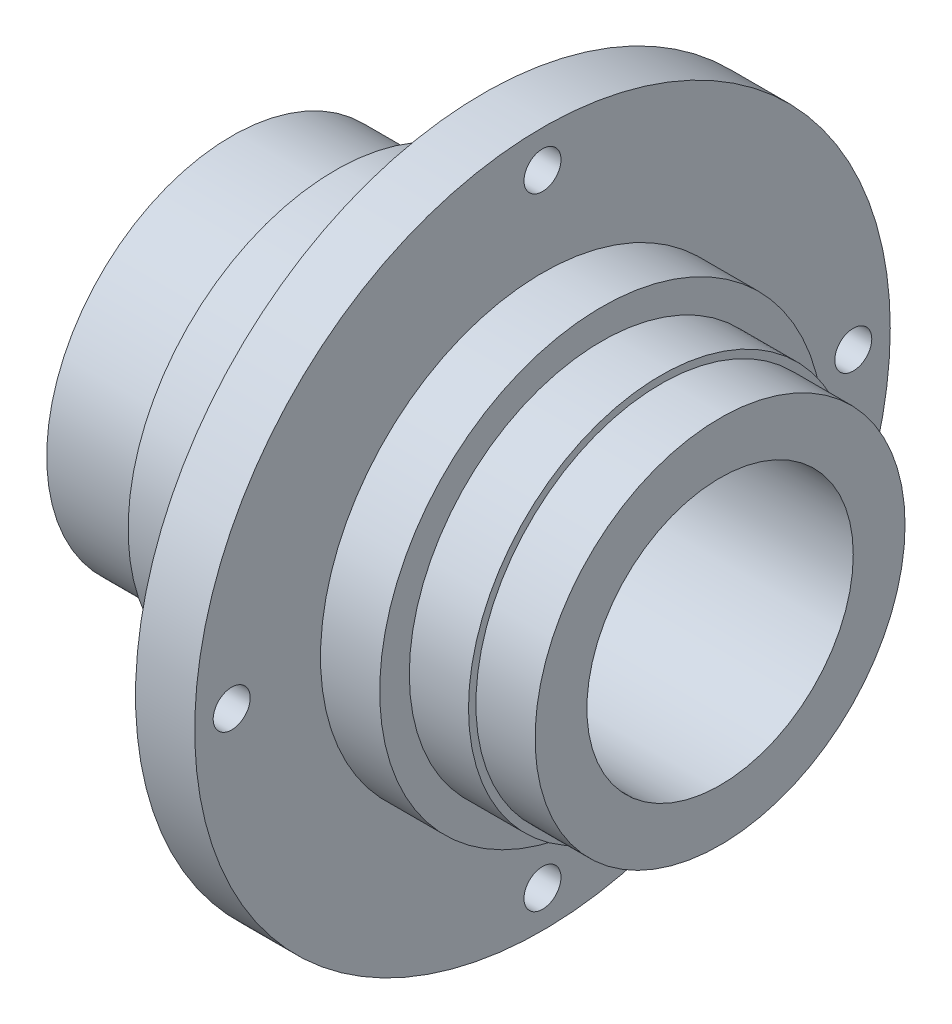
ISO-10303-21;
HEADER;
FILE_DESCRIPTION(('STEP AP214'),'2;1');
FILE_NAME('part.step','',(''),(''),'','','');
FILE_SCHEMA(('AUTOMOTIVE_DESIGN { 1 0 10303 214 1 1 1 1 }'));
ENDSEC;
DATA;
#1=APPLICATION_CONTEXT('core data for automotive mechanical design processes');
#2=APPLICATION_PROTOCOL_DEFINITION('international standard','automotive_design',2000,#1);
#3=PRODUCT_CONTEXT('',#1,'mechanical');
#4=PRODUCT('Part','Part','',(#3));
#5=PRODUCT_RELATED_PRODUCT_CATEGORY('part','',(#4));
#6=PRODUCT_DEFINITION_FORMATION('','',#4);
#7=PRODUCT_DEFINITION_CONTEXT('part definition',#1,'design');
#8=PRODUCT_DEFINITION('design','',#6,#7);
#9=PRODUCT_DEFINITION_SHAPE('','',#8);
#10=(LENGTH_UNIT() NAMED_UNIT(*) SI_UNIT(.MILLI.,.METRE.));
#11=(NAMED_UNIT(*) PLANE_ANGLE_UNIT() SI_UNIT($,.RADIAN.));
#12=(NAMED_UNIT(*) SI_UNIT($,.STERADIAN.) SOLID_ANGLE_UNIT());
#13=UNCERTAINTY_MEASURE_WITH_UNIT(LENGTH_MEASURE(1.E-05),#10,'distance_accuracy_value','');
#14=(GEOMETRIC_REPRESENTATION_CONTEXT(3) GLOBAL_UNCERTAINTY_ASSIGNED_CONTEXT((#13)) GLOBAL_UNIT_ASSIGNED_CONTEXT((#10,
#11,#12)) REPRESENTATION_CONTEXT('',''));
#15=CARTESIAN_POINT('',(0.,0.,0.));
#16=DIRECTION('',(0.,0.,1.));
#17=DIRECTION('',(1.,0.,0.));
#18=AXIS2_PLACEMENT_3D('',#15,#16,#17);
#19=CARTESIAN_POINT('',(7.,0.,0.));
#20=DIRECTION('',(-1.,0.,0.));
#21=DIRECTION('',(0.,0.,1.));
#22=AXIS2_PLACEMENT_3D('',#19,#20,#21);
#23=CYLINDRICAL_SURFACE('',#22,12.5);
#24=CARTESIAN_POINT('',(7.,0.,0.));
#25=DIRECTION('',(1.,0.,0.));
#26=DIRECTION('',(0.,0.,-1.));
#27=AXIS2_PLACEMENT_3D('',#24,#25,#26);
#28=CIRCLE('',#27,12.5);
#29=CARTESIAN_POINT('',(7.,0.,-12.5));
#30=VERTEX_POINT('',#29);
#31=EDGE_CURVE('E125',#30,#30,#28,.T.);
#32=ORIENTED_EDGE('',*,*,#31,.F.);
#33=EDGE_LOOP('',(#32));
#34=FACE_BOUND('',#33,.T.);
#35=CARTESIAN_POINT('',(0.,0.,0.));
#36=DIRECTION('',(1.,0.,0.));
#37=DIRECTION('',(0.,0.,-1.));
#38=AXIS2_PLACEMENT_3D('',#35,#36,#37);
#39=CIRCLE('',#38,12.5);
#40=CARTESIAN_POINT('',(0.,0.,-12.5));
#41=VERTEX_POINT('',#40);
#42=EDGE_CURVE('E122',#41,#41,#39,.T.);
#43=ORIENTED_EDGE('',*,*,#42,.T.);
#44=EDGE_LOOP('',(#43));
#45=FACE_BOUND('',#44,.T.);
#46=ADVANCED_FACE('F40',(#34,#45),#23,.T.);
#47=CARTESIAN_POINT('',(0.,0.,0.));
#48=DIRECTION('',(1.,0.,0.));
#49=DIRECTION('',(0.,0.,-1.));
#50=AXIS2_PLACEMENT_3D('',#47,#48,#49);
#51=PLANE('',#50);
#52=CARTESIAN_POINT('',(0.,0.,0.));
#53=DIRECTION('',(1.,0.,0.));
#54=DIRECTION('',(0.,0.,-1.));
#55=AXIS2_PLACEMENT_3D('',#52,#53,#54);
#56=CIRCLE('',#55,9.);
#57=CARTESIAN_POINT('',(0.,0.,-9.));
#58=VERTEX_POINT('',#57);
#59=EDGE_CURVE('E507',#58,#58,#56,.T.);
#60=ORIENTED_EDGE('',*,*,#59,.T.);
#61=EDGE_LOOP('',(#60));
#62=FACE_BOUND('',#61,.T.);
#63=CARTESIAN_POINT('',(0.,0.,-11.));
#64=DIRECTION('',(-1.,0.,0.));
#65=DIRECTION('',(0.,0.,1.));
#66=AXIS2_PLACEMENT_3D('',#63,#64,#65);
#67=CIRCLE('',#66,0.799999999999999);
#68=CARTESIAN_POINT('',(0.,0.,-10.2));
#69=VERTEX_POINT('',#68);
#70=EDGE_CURVE('E73',#69,#69,#67,.T.);
#71=ORIENTED_EDGE('',*,*,#70,.F.);
#72=EDGE_LOOP('',(#71));
#73=FACE_BOUND('',#72,.T.);
#74=CARTESIAN_POINT('',(0.,-11.,0.));
#75=DIRECTION('',(-1.,0.,0.));
#76=DIRECTION('',(0.,0.,1.));
#77=AXIS2_PLACEMENT_3D('',#74,#75,#76);
#78=CIRCLE('',#77,0.799999999999999);
#79=CARTESIAN_POINT('',(0.,-11.,0.8));
#80=VERTEX_POINT('',#79);
#81=EDGE_CURVE('E72',#80,#80,#78,.T.);
#82=ORIENTED_EDGE('',*,*,#81,.F.);
#83=EDGE_LOOP('',(#82));
#84=FACE_BOUND('',#83,.T.);
#85=CARTESIAN_POINT('',(0.,0.,11.));
#86=DIRECTION('',(-1.,0.,0.));
#87=DIRECTION('',(0.,0.,1.));
#88=AXIS2_PLACEMENT_3D('',#85,#86,#87);
#89=CIRCLE('',#88,0.799999999999999);
#90=CARTESIAN_POINT('',(0.,0.,11.8));
#91=VERTEX_POINT('',#90);
#92=EDGE_CURVE('E85',#91,#91,#89,.T.);
#93=ORIENTED_EDGE('',*,*,#92,.F.);
#94=EDGE_LOOP('',(#93));
#95=FACE_BOUND('',#94,.T.);
#96=CARTESIAN_POINT('',(0.,11.,0.));
#97=DIRECTION('',(-1.,0.,0.));
#98=DIRECTION('',(0.,0.,1.));
#99=AXIS2_PLACEMENT_3D('',#96,#97,#98);
#100=CIRCLE('',#99,0.799999999999999);
#101=CARTESIAN_POINT('',(0.,11.,0.799999999999999));
#102=VERTEX_POINT('',#101);
#103=EDGE_CURVE('E91',#102,#102,#100,.T.);
#104=ORIENTED_EDGE('',*,*,#103,.F.);
#105=EDGE_LOOP('',(#104));
#106=FACE_BOUND('',#105,.T.);
#107=ORIENTED_EDGE('',*,*,#42,.F.);
#108=EDGE_LOOP('',(#107));
#109=FACE_BOUND('',#108,.T.);
#110=ADVANCED_FACE('F156',(#62,#73,#84,#95,#106,#109),#51,.F.);
#111=CARTESIAN_POINT('',(17.,0.,0.));
#112=DIRECTION('',(-1.,0.,0.));
#113=DIRECTION('',(0.,0.,1.));
#114=AXIS2_PLACEMENT_3D('',#111,#112,#113);
#115=CYLINDRICAL_SURFACE('',#114,14.);
#116=CARTESIAN_POINT('',(17.,0.,0.));
#117=DIRECTION('',(1.,0.,0.));
#118=DIRECTION('',(0.,0.,-1.));
#119=AXIS2_PLACEMENT_3D('',#116,#117,#118);
#120=CIRCLE('',#119,14.);
#121=CARTESIAN_POINT('',(17.,0.,-14.));
#122=VERTEX_POINT('',#121);
#123=EDGE_CURVE('E119',#122,#122,#120,.T.);
#124=ORIENTED_EDGE('',*,*,#123,.F.);
#125=EDGE_LOOP('',(#124));
#126=FACE_BOUND('',#125,.T.);
#127=CARTESIAN_POINT('',(7.,0.,0.));
#128=DIRECTION('',(1.,0.,0.));
#129=DIRECTION('',(0.,0.,-1.));
#130=AXIS2_PLACEMENT_3D('',#127,#128,#129);
#131=CIRCLE('',#130,14.);
#132=CARTESIAN_POINT('',(7.,0.,-14.));
#133=VERTEX_POINT('',#132);
#134=EDGE_CURVE('E115',#133,#133,#131,.T.);
#135=ORIENTED_EDGE('',*,*,#134,.T.);
#136=EDGE_LOOP('',(#135));
#137=FACE_BOUND('',#136,.T.);
#138=ADVANCED_FACE('F161',(#126,#137),#115,.T.);
#139=CARTESIAN_POINT('',(7.,0.,0.));
#140=DIRECTION('',(1.,0.,0.));
#141=DIRECTION('',(0.,0.,-1.));
#142=AXIS2_PLACEMENT_3D('',#139,#140,#141);
#143=PLANE('',#142);
#144=ORIENTED_EDGE('',*,*,#31,.T.);
#145=EDGE_LOOP('',(#144));
#146=FACE_BOUND('',#145,.T.);
#147=ORIENTED_EDGE('',*,*,#134,.F.);
#148=EDGE_LOOP('',(#147));
#149=FACE_BOUND('',#148,.T.);
#150=ADVANCED_FACE('F168',(#146,#149),#143,.F.);
#151=CARTESIAN_POINT('',(21.,0.,0.));
#152=DIRECTION('',(-1.,0.,0.));
#153=DIRECTION('',(0.,0.,1.));
#154=AXIS2_PLACEMENT_3D('',#151,#152,#153);
#155=CYLINDRICAL_SURFACE('',#154,23.5);
#156=CARTESIAN_POINT('',(21.,0.,0.));
#157=DIRECTION('',(1.,0.,0.));
#158=DIRECTION('',(0.,0.,-1.));
#159=AXIS2_PLACEMENT_3D('',#156,#157,#158);
#160=CIRCLE('',#159,23.5);
#161=CARTESIAN_POINT('',(21.,0.,-23.5));
#162=VERTEX_POINT('',#161);
#163=EDGE_CURVE('E112',#162,#162,#160,.T.);
#164=ORIENTED_EDGE('',*,*,#163,.F.);
#165=EDGE_LOOP('',(#164));
#166=FACE_BOUND('',#165,.T.);
#167=CARTESIAN_POINT('',(17.,0.,0.));
#168=DIRECTION('',(1.,0.,0.));
#169=DIRECTION('',(0.,0.,-1.));
#170=AXIS2_PLACEMENT_3D('',#167,#168,#169);
#171=CIRCLE('',#170,23.5);
#172=CARTESIAN_POINT('',(17.,0.,-23.5));
#173=VERTEX_POINT('',#172);
#174=EDGE_CURVE('E116',#173,#173,#171,.T.);
#175=ORIENTED_EDGE('',*,*,#174,.T.);
#176=EDGE_LOOP('',(#175));
#177=FACE_BOUND('',#176,.T.);
#178=ADVANCED_FACE('F171',(#166,#177),#155,.T.);
#179=CARTESIAN_POINT('',(21.,0.,0.));
#180=DIRECTION('',(1.,0.,0.));
#181=DIRECTION('',(0.,0.,-1.));
#182=AXIS2_PLACEMENT_3D('',#179,#180,#181);
#183=PLANE('',#182);
#184=CARTESIAN_POINT('',(21.,0.,0.));
#185=DIRECTION('',(1.,0.,0.));
#186=DIRECTION('',(0.,0.,-1.));
#187=AXIS2_PLACEMENT_3D('',#184,#185,#186);
#188=CIRCLE('',#187,15.);
#189=CARTESIAN_POINT('',(21.,0.,-15.));
#190=VERTEX_POINT('',#189);
#191=EDGE_CURVE('E517',#190,#190,#188,.T.);
#192=ORIENTED_EDGE('',*,*,#191,.F.);
#193=EDGE_LOOP('',(#192));
#194=FACE_BOUND('',#193,.T.);
#195=CARTESIAN_POINT('',(21.,21.,0.));
#196=DIRECTION('',(1.,0.,0.));
#197=DIRECTION('',(0.,0.,-1.));
#198=AXIS2_PLACEMENT_3D('',#195,#196,#197);
#199=CIRCLE('',#198,1.25);
#200=CARTESIAN_POINT('',(21.,21.,-1.25));
#201=VERTEX_POINT('',#200);
#202=EDGE_CURVE('E97',#201,#201,#199,.T.);
#203=ORIENTED_EDGE('',*,*,#202,.F.);
#204=EDGE_LOOP('',(#203));
#205=FACE_BOUND('',#204,.T.);
#206=CARTESIAN_POINT('',(21.,0.,-21.));
#207=DIRECTION('',(1.,0.,0.));
#208=DIRECTION('',(0.,0.,-1.));
#209=AXIS2_PLACEMENT_3D('',#206,#207,#208);
#210=CIRCLE('',#209,1.25);
#211=CARTESIAN_POINT('',(21.,0.,-22.25));
#212=VERTEX_POINT('',#211);
#213=EDGE_CURVE('E100',#212,#212,#210,.T.);
#214=ORIENTED_EDGE('',*,*,#213,.F.);
#215=EDGE_LOOP('',(#214));
#216=FACE_BOUND('',#215,.T.);
#217=CARTESIAN_POINT('',(21.,-21.,0.));
#218=DIRECTION('',(1.,0.,0.));
#219=DIRECTION('',(0.,0.,-1.));
#220=AXIS2_PLACEMENT_3D('',#217,#218,#219);
#221=CIRCLE('',#220,1.25);
#222=CARTESIAN_POINT('',(21.,-21.,-1.25));
#223=VERTEX_POINT('',#222);
#224=EDGE_CURVE('E104',#223,#223,#221,.T.);
#225=ORIENTED_EDGE('',*,*,#224,.F.);
#226=EDGE_LOOP('',(#225));
#227=FACE_BOUND('',#226,.T.);
#228=CARTESIAN_POINT('',(21.,0.,21.));
#229=DIRECTION('',(1.,0.,0.));
#230=DIRECTION('',(0.,0.,-1.));
#231=AXIS2_PLACEMENT_3D('',#228,#229,#230);
#232=CIRCLE('',#231,1.25);
#233=CARTESIAN_POINT('',(21.,0.,19.75));
#234=VERTEX_POINT('',#233);
#235=EDGE_CURVE('E108',#234,#234,#232,.T.);
#236=ORIENTED_EDGE('',*,*,#235,.F.);
#237=EDGE_LOOP('',(#236));
#238=FACE_BOUND('',#237,.T.);
#239=ORIENTED_EDGE('',*,*,#163,.T.);
#240=EDGE_LOOP('',(#239));
#241=FACE_BOUND('',#240,.T.);
#242=ADVANCED_FACE('F184',(#194,#205,#216,#227,#238,#241),#183,.T.);
#243=CARTESIAN_POINT('',(17.,0.,0.));
#244=DIRECTION('',(1.,0.,0.));
#245=DIRECTION('',(0.,0.,-1.));
#246=AXIS2_PLACEMENT_3D('',#243,#244,#245);
#247=PLANE('',#246);
#248=CARTESIAN_POINT('',(17.,21.,0.));
#249=DIRECTION('',(1.,0.,0.));
#250=DIRECTION('',(0.,0.,-1.));
#251=AXIS2_PLACEMENT_3D('',#248,#249,#250);
#252=CIRCLE('',#251,1.25);
#253=CARTESIAN_POINT('',(17.,21.,-1.25));
#254=VERTEX_POINT('',#253);
#255=EDGE_CURVE('E43',#254,#254,#252,.T.);
#256=ORIENTED_EDGE('',*,*,#255,.T.);
#257=EDGE_LOOP('',(#256));
#258=FACE_BOUND('',#257,.T.);
#259=CARTESIAN_POINT('',(17.,0.,-21.));
#260=DIRECTION('',(1.,0.,0.));
#261=DIRECTION('',(0.,0.,-1.));
#262=AXIS2_PLACEMENT_3D('',#259,#260,#261);
#263=CIRCLE('',#262,1.25);
#264=CARTESIAN_POINT('',(17.,0.,-22.25));
#265=VERTEX_POINT('',#264);
#266=EDGE_CURVE('E103',#265,#265,#263,.T.);
#267=ORIENTED_EDGE('',*,*,#266,.T.);
#268=EDGE_LOOP('',(#267));
#269=FACE_BOUND('',#268,.T.);
#270=CARTESIAN_POINT('',(17.,-21.,0.));
#271=DIRECTION('',(1.,0.,0.));
#272=DIRECTION('',(0.,0.,-1.));
#273=AXIS2_PLACEMENT_3D('',#270,#271,#272);
#274=CIRCLE('',#273,1.25);
#275=CARTESIAN_POINT('',(17.,-21.,-1.25));
#276=VERTEX_POINT('',#275);
#277=EDGE_CURVE('E107',#276,#276,#274,.T.);
#278=ORIENTED_EDGE('',*,*,#277,.T.);
#279=EDGE_LOOP('',(#278));
#280=FACE_BOUND('',#279,.T.);
#281=CARTESIAN_POINT('',(17.,0.,21.));
#282=DIRECTION('',(1.,0.,0.));
#283=DIRECTION('',(0.,0.,-1.));
#284=AXIS2_PLACEMENT_3D('',#281,#282,#283);
#285=CIRCLE('',#284,1.25);
#286=CARTESIAN_POINT('',(17.,0.,19.75));
#287=VERTEX_POINT('',#286);
#288=EDGE_CURVE('E111',#287,#287,#285,.T.);
#289=ORIENTED_EDGE('',*,*,#288,.T.);
#290=EDGE_LOOP('',(#289));
#291=FACE_BOUND('',#290,.T.);
#292=ORIENTED_EDGE('',*,*,#123,.T.);
#293=EDGE_LOOP('',(#292));
#294=FACE_BOUND('',#293,.T.);
#295=ORIENTED_EDGE('',*,*,#174,.F.);
#296=EDGE_LOOP('',(#295));
#297=FACE_BOUND('',#296,.T.);
#298=ADVANCED_FACE('F136',(#258,#269,#280,#291,#294,#297),#247,.F.);
#299=CARTESIAN_POINT('',(21.,0.,21.));
#300=DIRECTION('',(1.,0.,0.));
#301=DIRECTION('',(0.,0.,-1.));
#302=AXIS2_PLACEMENT_3D('',#299,#300,#301);
#303=CYLINDRICAL_SURFACE('',#302,1.25);
#304=ORIENTED_EDGE('',*,*,#235,.T.);
#305=EDGE_LOOP('',(#304));
#306=FACE_BOUND('',#305,.T.);
#307=ORIENTED_EDGE('',*,*,#288,.F.);
#308=EDGE_LOOP('',(#307));
#309=FACE_BOUND('',#308,.T.);
#310=ADVANCED_FACE('F152',(#306,#309),#303,.F.);
#311=CARTESIAN_POINT('',(21.,-21.,0.));
#312=DIRECTION('',(1.,0.,0.));
#313=DIRECTION('',(0.,0.,-1.));
#314=AXIS2_PLACEMENT_3D('',#311,#312,#313);
#315=CYLINDRICAL_SURFACE('',#314,1.25);
#316=ORIENTED_EDGE('',*,*,#224,.T.);
#317=EDGE_LOOP('',(#316));
#318=FACE_BOUND('',#317,.T.);
#319=ORIENTED_EDGE('',*,*,#277,.F.);
#320=EDGE_LOOP('',(#319));
#321=FACE_BOUND('',#320,.T.);
#322=ADVANCED_FACE('F142',(#318,#321),#315,.F.);
#323=CARTESIAN_POINT('',(21.,0.,-21.));
#324=DIRECTION('',(1.,0.,0.));
#325=DIRECTION('',(0.,0.,-1.));
#326=AXIS2_PLACEMENT_3D('',#323,#324,#325);
#327=CYLINDRICAL_SURFACE('',#326,1.25);
#328=ORIENTED_EDGE('',*,*,#213,.T.);
#329=EDGE_LOOP('',(#328));
#330=FACE_BOUND('',#329,.T.);
#331=ORIENTED_EDGE('',*,*,#266,.F.);
#332=EDGE_LOOP('',(#331));
#333=FACE_BOUND('',#332,.T.);
#334=ADVANCED_FACE('F139',(#330,#333),#327,.F.);
#335=CARTESIAN_POINT('',(21.,21.,0.));
#336=DIRECTION('',(1.,0.,0.));
#337=DIRECTION('',(0.,0.,-1.));
#338=AXIS2_PLACEMENT_3D('',#335,#336,#337);
#339=CYLINDRICAL_SURFACE('',#338,1.25);
#340=ORIENTED_EDGE('',*,*,#202,.T.);
#341=EDGE_LOOP('',(#340));
#342=FACE_BOUND('',#341,.T.);
#343=ORIENTED_EDGE('',*,*,#255,.F.);
#344=EDGE_LOOP('',(#343));
#345=FACE_BOUND('',#344,.T.);
#346=ADVANCED_FACE('F141',(#342,#345),#339,.F.);
#347=CARTESIAN_POINT('',(6.,11.,0.));
#348=DIRECTION('',(-1.,0.,0.));
#349=DIRECTION('',(0.,0.,1.));
#350=AXIS2_PLACEMENT_3D('',#347,#348,#349);
#351=CONICAL_SURFACE('',#350,0.799999999999997,1.02974425867665);
#352=CARTESIAN_POINT('',(6.48068849522205,11.,0.));
#353=VERTEX_POINT('',#352);
#354=VERTEX_LOOP('',#353);
#355=FACE_BOUND('',#354,.T.);
#356=CARTESIAN_POINT('',(6.,11.,0.));
#357=DIRECTION('',(-1.,0.,0.));
#358=DIRECTION('',(0.,0.,1.));
#359=AXIS2_PLACEMENT_3D('',#356,#357,#358);
#360=CIRCLE('',#359,0.799999999999997);
#361=CARTESIAN_POINT('',(6.,11.,0.799999999999997));
#362=VERTEX_POINT('',#361);
#363=EDGE_CURVE('E94',#362,#362,#360,.T.);
#364=ORIENTED_EDGE('',*,*,#363,.T.);
#365=EDGE_LOOP('',(#364));
#366=FACE_BOUND('',#365,.T.);
#367=ADVANCED_FACE('F149',(#355,#366),#351,.F.);
#368=CARTESIAN_POINT('',(0.,11.,0.));
#369=DIRECTION('',(-1.,0.,0.));
#370=DIRECTION('',(0.,0.,1.));
#371=AXIS2_PLACEMENT_3D('',#368,#369,#370);
#372=CYLINDRICAL_SURFACE('',#371,0.799999999999998);
#373=ORIENTED_EDGE('',*,*,#363,.F.);
#374=EDGE_LOOP('',(#373));
#375=FACE_BOUND('',#374,.T.);
#376=ORIENTED_EDGE('',*,*,#103,.T.);
#377=EDGE_LOOP('',(#376));
#378=FACE_BOUND('',#377,.T.);
#379=ADVANCED_FACE('F236',(#375,#378),#372,.F.);
#380=CARTESIAN_POINT('',(6.,0.,11.));
#381=DIRECTION('',(-1.,0.,0.));
#382=DIRECTION('',(0.,0.,1.));
#383=AXIS2_PLACEMENT_3D('',#380,#381,#382);
#384=CONICAL_SURFACE('',#383,0.799999999999997,1.02974425867665);
#385=CARTESIAN_POINT('',(6.48068849522205,0.,11.));
#386=VERTEX_POINT('',#385);
#387=VERTEX_LOOP('',#386);
#388=FACE_BOUND('',#387,.T.);
#389=CARTESIAN_POINT('',(6.,0.,11.));
#390=DIRECTION('',(-1.,0.,0.));
#391=DIRECTION('',(0.,0.,1.));
#392=AXIS2_PLACEMENT_3D('',#389,#390,#391);
#393=CIRCLE('',#392,0.799999999999997);
#394=CARTESIAN_POINT('',(6.,0.,11.8));
#395=VERTEX_POINT('',#394);
#396=EDGE_CURVE('E88',#395,#395,#393,.T.);
#397=ORIENTED_EDGE('',*,*,#396,.T.);
#398=EDGE_LOOP('',(#397));
#399=FACE_BOUND('',#398,.T.);
#400=ADVANCED_FACE('F242',(#388,#399),#384,.F.);
#401=CARTESIAN_POINT('',(0.,0.,11.));
#402=DIRECTION('',(-1.,0.,0.));
#403=DIRECTION('',(0.,0.,1.));
#404=AXIS2_PLACEMENT_3D('',#401,#402,#403);
#405=CYLINDRICAL_SURFACE('',#404,0.799999999999998);
#406=ORIENTED_EDGE('',*,*,#396,.F.);
#407=EDGE_LOOP('',(#406));
#408=FACE_BOUND('',#407,.T.);
#409=ORIENTED_EDGE('',*,*,#92,.T.);
#410=EDGE_LOOP('',(#409));
#411=FACE_BOUND('',#410,.T.);
#412=ADVANCED_FACE('F264',(#408,#411),#405,.F.);
#413=CARTESIAN_POINT('',(6.,-11.,0.));
#414=DIRECTION('',(-1.,0.,0.));
#415=DIRECTION('',(0.,0.,1.));
#416=AXIS2_PLACEMENT_3D('',#413,#414,#415);
#417=CONICAL_SURFACE('',#416,0.799999999999997,1.02974425867665);
#418=CARTESIAN_POINT('',(6.48068849522205,-11.,0.));
#419=VERTEX_POINT('',#418);
#420=VERTEX_LOOP('',#419);
#421=FACE_BOUND('',#420,.T.);
#422=CARTESIAN_POINT('',(6.,-11.,0.));
#423=DIRECTION('',(-1.,0.,0.));
#424=DIRECTION('',(0.,0.,1.));
#425=AXIS2_PLACEMENT_3D('',#422,#423,#424);
#426=CIRCLE('',#425,0.799999999999997);
#427=CARTESIAN_POINT('',(6.,-11.,0.799999999999998));
#428=VERTEX_POINT('',#427);
#429=EDGE_CURVE('E76',#428,#428,#426,.T.);
#430=ORIENTED_EDGE('',*,*,#429,.T.);
#431=EDGE_LOOP('',(#430));
#432=FACE_BOUND('',#431,.T.);
#433=ADVANCED_FACE('F267',(#421,#432),#417,.F.);
#434=CARTESIAN_POINT('',(0.,-11.,0.));
#435=DIRECTION('',(-1.,0.,0.));
#436=DIRECTION('',(0.,0.,1.));
#437=AXIS2_PLACEMENT_3D('',#434,#435,#436);
#438=CYLINDRICAL_SURFACE('',#437,0.799999999999998);
#439=ORIENTED_EDGE('',*,*,#429,.F.);
#440=EDGE_LOOP('',(#439));
#441=FACE_BOUND('',#440,.T.);
#442=ORIENTED_EDGE('',*,*,#81,.T.);
#443=EDGE_LOOP('',(#442));
#444=FACE_BOUND('',#443,.T.);
#445=ADVANCED_FACE('F66',(#441,#444),#438,.F.);
#446=CARTESIAN_POINT('',(6.,0.,-11.));
#447=DIRECTION('',(-1.,0.,0.));
#448=DIRECTION('',(0.,0.,1.));
#449=AXIS2_PLACEMENT_3D('',#446,#447,#448);
#450=CONICAL_SURFACE('',#449,0.799999999999997,1.02974425867665);
#451=CARTESIAN_POINT('',(6.48068849522205,0.,-11.));
#452=VERTEX_POINT('',#451);
#453=VERTEX_LOOP('',#452);
#454=FACE_BOUND('',#453,.T.);
#455=CARTESIAN_POINT('',(6.,0.,-11.));
#456=DIRECTION('',(-1.,0.,0.));
#457=DIRECTION('',(0.,0.,1.));
#458=AXIS2_PLACEMENT_3D('',#455,#456,#457);
#459=CIRCLE('',#458,0.799999999999997);
#460=CARTESIAN_POINT('',(6.,0.,-10.2));
#461=VERTEX_POINT('',#460);
#462=EDGE_CURVE('E70',#461,#461,#459,.T.);
#463=ORIENTED_EDGE('',*,*,#462,.T.);
#464=EDGE_LOOP('',(#463));
#465=FACE_BOUND('',#464,.T.);
#466=ADVANCED_FACE('F62',(#454,#465),#450,.F.);
#467=CARTESIAN_POINT('',(0.,0.,-11.));
#468=DIRECTION('',(-1.,0.,0.));
#469=DIRECTION('',(0.,0.,1.));
#470=AXIS2_PLACEMENT_3D('',#467,#468,#469);
#471=CYLINDRICAL_SURFACE('',#470,0.799999999999998);
#472=ORIENTED_EDGE('',*,*,#462,.F.);
#473=EDGE_LOOP('',(#472));
#474=FACE_BOUND('',#473,.T.);
#475=ORIENTED_EDGE('',*,*,#70,.T.);
#476=EDGE_LOOP('',(#475));
#477=FACE_BOUND('',#476,.T.);
#478=ADVANCED_FACE('F65',(#474,#477),#471,.F.);
#479=CARTESIAN_POINT('',(25.,0.,0.));
#480=DIRECTION('',(-1.,0.,0.));
#481=DIRECTION('',(0.,0.,1.));
#482=AXIS2_PLACEMENT_3D('',#479,#480,#481);
#483=CYLINDRICAL_SURFACE('',#482,15.);
#484=CARTESIAN_POINT('',(25.,0.,0.));
#485=DIRECTION('',(1.,0.,0.));
#486=DIRECTION('',(0.,0.,-1.));
#487=AXIS2_PLACEMENT_3D('',#484,#485,#486);
#488=CIRCLE('',#487,15.);
#489=CARTESIAN_POINT('',(25.,0.,-15.));
#490=VERTEX_POINT('',#489);
#491=EDGE_CURVE('E79',#490,#490,#488,.T.);
#492=ORIENTED_EDGE('',*,*,#491,.F.);
#493=EDGE_LOOP('',(#492));
#494=FACE_BOUND('',#493,.T.);
#495=ORIENTED_EDGE('',*,*,#191,.T.);
#496=EDGE_LOOP('',(#495));
#497=FACE_BOUND('',#496,.T.);
#498=ADVANCED_FACE('F291',(#494,#497),#483,.T.);
#499=CARTESIAN_POINT('',(25.,0.,0.));
#500=DIRECTION('',(1.,0.,0.));
#501=DIRECTION('',(0.,0.,-1.));
#502=AXIS2_PLACEMENT_3D('',#499,#500,#501);
#503=PLANE('',#502);
#504=CARTESIAN_POINT('',(25.,0.,0.));
#505=DIRECTION('',(1.,0.,0.));
#506=DIRECTION('',(0.,0.,-1.));
#507=AXIS2_PLACEMENT_3D('',#504,#505,#506);
#508=CIRCLE('',#507,13.);
#509=CARTESIAN_POINT('',(25.,0.,-13.));
#510=VERTEX_POINT('',#509);
#511=EDGE_CURVE('E48',#510,#510,#508,.T.);
#512=ORIENTED_EDGE('',*,*,#511,.F.);
#513=EDGE_LOOP('',(#512));
#514=FACE_BOUND('',#513,.T.);
#515=ORIENTED_EDGE('',*,*,#491,.T.);
#516=EDGE_LOOP('',(#515));
#517=FACE_BOUND('',#516,.T.);
#518=ADVANCED_FACE('F305',(#514,#517),#503,.T.);
#519=CARTESIAN_POINT('',(29.,0.,0.));
#520=DIRECTION('',(-1.,0.,0.));
#521=DIRECTION('',(0.,0.,1.));
#522=AXIS2_PLACEMENT_3D('',#519,#520,#521);
#523=CYLINDRICAL_SURFACE('',#522,13.);
#524=CARTESIAN_POINT('',(29.,0.,0.));
#525=DIRECTION('',(1.,0.,0.));
#526=DIRECTION('',(0.,0.,-1.));
#527=AXIS2_PLACEMENT_3D('',#524,#525,#526);
#528=CIRCLE('',#527,13.);
#529=CARTESIAN_POINT('',(29.,0.,-13.));
#530=VERTEX_POINT('',#529);
#531=EDGE_CURVE('E513',#530,#530,#528,.T.);
#532=ORIENTED_EDGE('',*,*,#531,.F.);
#533=EDGE_LOOP('',(#532));
#534=FACE_BOUND('',#533,.T.);
#535=ORIENTED_EDGE('',*,*,#511,.T.);
#536=EDGE_LOOP('',(#535));
#537=FACE_BOUND('',#536,.T.);
#538=ADVANCED_FACE('F314',(#534,#537),#523,.T.);
#539=CARTESIAN_POINT('',(29.,0.,0.));
#540=DIRECTION('',(1.,0.,0.));
#541=DIRECTION('',(0.,0.,-1.));
#542=AXIS2_PLACEMENT_3D('',#539,#540,#541);
#543=PLANE('',#542);
#544=CARTESIAN_POINT('',(29.,0.,0.));
#545=DIRECTION('',(1.,0.,0.));
#546=DIRECTION('',(0.,0.,-1.));
#547=AXIS2_PLACEMENT_3D('',#544,#545,#546);
#548=CIRCLE('',#547,12.5);
#549=CARTESIAN_POINT('',(29.,0.,-12.5));
#550=VERTEX_POINT('',#549);
#551=EDGE_CURVE('E11',#550,#550,#548,.T.);
#552=ORIENTED_EDGE('',*,*,#551,.F.);
#553=EDGE_LOOP('',(#552));
#554=FACE_BOUND('',#553,.T.);
#555=ORIENTED_EDGE('',*,*,#531,.T.);
#556=EDGE_LOOP('',(#555));
#557=FACE_BOUND('',#556,.T.);
#558=ADVANCED_FACE('F322',(#554,#557),#543,.T.);
#559=CARTESIAN_POINT('',(33.,0.,0.));
#560=DIRECTION('',(-1.,0.,0.));
#561=DIRECTION('',(0.,0.,1.));
#562=AXIS2_PLACEMENT_3D('',#559,#560,#561);
#563=CYLINDRICAL_SURFACE('',#562,12.5);
#564=CARTESIAN_POINT('',(33.,0.,0.));
#565=DIRECTION('',(1.,0.,0.));
#566=DIRECTION('',(0.,0.,-1.));
#567=AXIS2_PLACEMENT_3D('',#564,#565,#566);
#568=CIRCLE('',#567,12.5);
#569=CARTESIAN_POINT('',(33.,0.,-12.5));
#570=VERTEX_POINT('',#569);
#571=EDGE_CURVE('E509',#570,#570,#568,.T.);
#572=ORIENTED_EDGE('',*,*,#571,.F.);
#573=EDGE_LOOP('',(#572));
#574=FACE_BOUND('',#573,.T.);
#575=ORIENTED_EDGE('',*,*,#551,.T.);
#576=EDGE_LOOP('',(#575));
#577=FACE_BOUND('',#576,.T.);
#578=ADVANCED_FACE('F330',(#574,#577),#563,.T.);
#579=CARTESIAN_POINT('',(33.,0.,0.));
#580=DIRECTION('',(1.,0.,0.));
#581=DIRECTION('',(0.,0.,-1.));
#582=AXIS2_PLACEMENT_3D('',#579,#580,#581);
#583=PLANE('',#582);
#584=CARTESIAN_POINT('',(33.,0.,0.));
#585=DIRECTION('',(1.,0.,0.));
#586=DIRECTION('',(0.,0.,-1.));
#587=AXIS2_PLACEMENT_3D('',#584,#585,#586);
#588=CIRCLE('',#587,9.);
#589=CARTESIAN_POINT('',(33.,0.,-9.));
#590=VERTEX_POINT('',#589);
#591=EDGE_CURVE('E504',#590,#590,#588,.T.);
#592=ORIENTED_EDGE('',*,*,#591,.F.);
#593=EDGE_LOOP('',(#592));
#594=FACE_BOUND('',#593,.T.);
#595=ORIENTED_EDGE('',*,*,#571,.T.);
#596=EDGE_LOOP('',(#595));
#597=FACE_BOUND('',#596,.T.);
#598=ADVANCED_FACE('F338',(#594,#597),#583,.T.);
#599=CARTESIAN_POINT('',(33.,0.,0.));
#600=DIRECTION('',(-1.,0.,0.));
#601=DIRECTION('',(0.,0.,1.));
#602=AXIS2_PLACEMENT_3D('',#599,#600,#601);
#603=CYLINDRICAL_SURFACE('',#602,9.);
#604=ORIENTED_EDGE('',*,*,#591,.T.);
#605=EDGE_LOOP('',(#604));
#606=FACE_BOUND('',#605,.T.);
#607=ORIENTED_EDGE('',*,*,#59,.F.);
#608=EDGE_LOOP('',(#607));
#609=FACE_BOUND('',#608,.T.);
#610=ADVANCED_FACE('F347',(#606,#609),#603,.F.);
#611=CLOSED_SHELL('',(#46,#110,#138,#150,#178,#242,#298,#310,#322,#334,#346,#367,#379,#400,#412,
#433,#445,#466,#478,#498,#518,#538,#558,#578,#598,#610));
#612=MANIFOLD_SOLID_BREP('B2',#611);
#613=ADVANCED_BREP_SHAPE_REPRESENTATION('',(#18,#612),#14);
#614=SHAPE_DEFINITION_REPRESENTATION(#9,#613);
ENDSEC;
END-ISO-10303-21;
